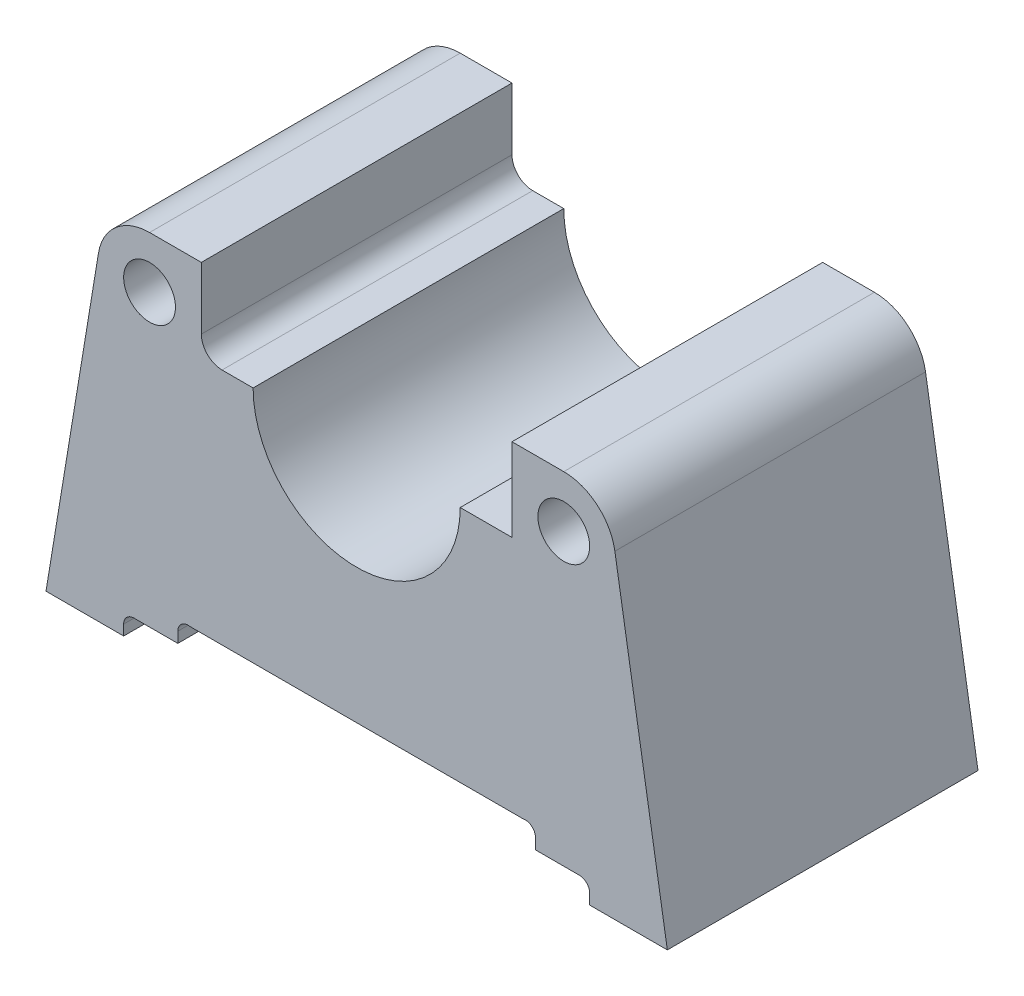
ISO-10303-21;
HEADER;
FILE_DESCRIPTION(('STEP AP214'),'2;1');
FILE_NAME('part.step','',(''),(''),'','','');
FILE_SCHEMA(('AUTOMOTIVE_DESIGN { 1 0 10303 214 1 1 1 1 }'));
ENDSEC;
DATA;
#1=APPLICATION_CONTEXT('core data for automotive mechanical design processes');
#2=APPLICATION_PROTOCOL_DEFINITION('international standard','automotive_design',2000,#1);
#3=PRODUCT_CONTEXT('',#1,'mechanical');
#4=PRODUCT('Part','Part','',(#3));
#5=PRODUCT_RELATED_PRODUCT_CATEGORY('part','',(#4));
#6=PRODUCT_DEFINITION_FORMATION('','',#4);
#7=PRODUCT_DEFINITION_CONTEXT('part definition',#1,'design');
#8=PRODUCT_DEFINITION('design','',#6,#7);
#9=PRODUCT_DEFINITION_SHAPE('','',#8);
#10=(LENGTH_UNIT() NAMED_UNIT(*) SI_UNIT(.MILLI.,.METRE.));
#11=(NAMED_UNIT(*) PLANE_ANGLE_UNIT() SI_UNIT($,.RADIAN.));
#12=(NAMED_UNIT(*) SI_UNIT($,.STERADIAN.) SOLID_ANGLE_UNIT());
#13=UNCERTAINTY_MEASURE_WITH_UNIT(LENGTH_MEASURE(1.E-05),#10,'distance_accuracy_value','');
#14=(GEOMETRIC_REPRESENTATION_CONTEXT(3) GLOBAL_UNCERTAINTY_ASSIGNED_CONTEXT((#13)) GLOBAL_UNIT_ASSIGNED_CONTEXT((#10,
#11,#12)) REPRESENTATION_CONTEXT('',''));
#15=CARTESIAN_POINT('',(0.,0.,0.));
#16=DIRECTION('',(0.,0.,1.));
#17=DIRECTION('',(1.,0.,0.));
#18=AXIS2_PLACEMENT_3D('',#15,#16,#17);
#19=CARTESIAN_POINT('',(-13.,29.,15.));
#20=DIRECTION('',(0.,0.,-1.));
#21=DIRECTION('',(-1.,0.,0.));
#22=AXIS2_PLACEMENT_3D('',#19,#20,#21);
#23=CYLINDRICAL_SURFACE('',#22,2.);
#24=CARTESIAN_POINT('',(-13.,29.,-15.));
#25=DIRECTION('',(0.,0.,1.));
#26=DIRECTION('',(1.,0.,0.));
#27=AXIS2_PLACEMENT_3D('',#24,#25,#26);
#28=CIRCLE('',#27,2.);
#29=CARTESIAN_POINT('',(-15.,29.,-15.));
#30=VERTEX_POINT('',#29);
#31=CARTESIAN_POINT('',(-13.,27.,-15.));
#32=VERTEX_POINT('',#31);
#33=EDGE_CURVE('E235',#30,#32,#28,.T.);
#34=ORIENTED_EDGE('',*,*,#33,.F.);
#35=DIRECTION('',(0.,0.,-1.));
#36=VECTOR('',#35,1.);
#37=CARTESIAN_POINT('',(-15.,29.,15.));
#38=LINE('',#37,#36);
#39=CARTESIAN_POINT('',(-15.,29.,15.));
#40=VERTEX_POINT('',#39);
#41=EDGE_CURVE('E11',#40,#30,#38,.T.);
#42=ORIENTED_EDGE('',*,*,#41,.F.);
#43=CARTESIAN_POINT('',(-13.,29.,15.));
#44=DIRECTION('',(0.,0.,1.));
#45=DIRECTION('',(1.,0.,0.));
#46=AXIS2_PLACEMENT_3D('',#43,#44,#45);
#47=CIRCLE('',#46,2.);
#48=CARTESIAN_POINT('',(-13.,27.,15.));
#49=VERTEX_POINT('',#48);
#50=EDGE_CURVE('E300',#40,#49,#47,.T.);
#51=ORIENTED_EDGE('',*,*,#50,.T.);
#52=DIRECTION('',(0.,0.,-1.));
#53=VECTOR('',#52,1.);
#54=CARTESIAN_POINT('',(-13.,27.,15.));
#55=LINE('',#54,#53);
#56=EDGE_CURVE('E49',#49,#32,#55,.T.);
#57=ORIENTED_EDGE('',*,*,#56,.T.);
#58=EDGE_LOOP('',(#34,#42,#51,#57));
#59=FACE_BOUND('',#58,.T.);
#60=ADVANCED_FACE('F33',(#59),#23,.F.);
#61=CARTESIAN_POINT('',(-15.,0.,15.));
#62=DIRECTION('',(1.,0.,0.));
#63=DIRECTION('',(0.,1.,0.));
#64=AXIS2_PLACEMENT_3D('',#61,#62,#63);
#65=PLANE('',#64);
#66=DIRECTION('',(0.,-1.,0.));
#67=VECTOR('',#66,1.);
#68=CARTESIAN_POINT('',(-15.,0.,-15.));
#69=LINE('',#68,#67);
#70=CARTESIAN_POINT('',(-15.,35.,-15.));
#71=VERTEX_POINT('',#70);
#72=EDGE_CURVE('E237',#71,#30,#69,.T.);
#73=ORIENTED_EDGE('',*,*,#72,.F.);
#74=DIRECTION('',(0.,0.,-1.));
#75=VECTOR('',#74,1.);
#76=CARTESIAN_POINT('',(-15.,35.,15.));
#77=LINE('',#76,#75);
#78=CARTESIAN_POINT('',(-15.,35.,15.));
#79=VERTEX_POINT('',#78);
#80=EDGE_CURVE('E41',#79,#71,#77,.T.);
#81=ORIENTED_EDGE('',*,*,#80,.F.);
#82=DIRECTION('',(0.,-1.,0.));
#83=VECTOR('',#82,1.);
#84=CARTESIAN_POINT('',(-15.,0.,15.));
#85=LINE('',#84,#83);
#86=EDGE_CURVE('E367',#79,#40,#85,.T.);
#87=ORIENTED_EDGE('',*,*,#86,.T.);
#88=ORIENTED_EDGE('',*,*,#41,.T.);
#89=EDGE_LOOP('',(#73,#81,#87,#88));
#90=FACE_BOUND('',#89,.T.);
#91=ADVANCED_FACE('F366',(#90),#65,.T.);
#92=CARTESIAN_POINT('',(0.,35.,15.));
#93=DIRECTION('',(0.,-1.,0.));
#94=DIRECTION('',(0.,0.,-1.));
#95=AXIS2_PLACEMENT_3D('',#92,#93,#94);
#96=PLANE('',#95);
#97=DIRECTION('',(-1.,0.,0.));
#98=VECTOR('',#97,1.);
#99=CARTESIAN_POINT('',(0.,35.,-15.));
#100=LINE('',#99,#98);
#101=CARTESIAN_POINT('',(-20.,35.,-15.));
#102=VERTEX_POINT('',#101);
#103=EDGE_CURVE('E240',#71,#102,#100,.T.);
#104=ORIENTED_EDGE('',*,*,#103,.T.);
#105=DIRECTION('',(0.,0.,-1.));
#106=VECTOR('',#105,1.);
#107=CARTESIAN_POINT('',(-20.,35.,15.));
#108=LINE('',#107,#106);
#109=CARTESIAN_POINT('',(-20.,35.,15.));
#110=VERTEX_POINT('',#109);
#111=EDGE_CURVE('E351',#110,#102,#108,.T.);
#112=ORIENTED_EDGE('',*,*,#111,.F.);
#113=DIRECTION('',(-1.,0.,0.));
#114=VECTOR('',#113,1.);
#115=CARTESIAN_POINT('',(0.,35.,15.));
#116=LINE('',#115,#114);
#117=EDGE_CURVE('E357',#79,#110,#116,.T.);
#118=ORIENTED_EDGE('',*,*,#117,.F.);
#119=ORIENTED_EDGE('',*,*,#80,.T.);
#120=EDGE_LOOP('',(#104,#112,#118,#119));
#121=FACE_BOUND('',#120,.T.);
#122=ADVANCED_FACE('F355',(#121),#96,.F.);
#123=CARTESIAN_POINT('',(-20.,30.,15.));
#124=DIRECTION('',(0.,0.,-1.));
#125=DIRECTION('',(-1.,0.,0.));
#126=AXIS2_PLACEMENT_3D('',#123,#124,#125);
#127=CYLINDRICAL_SURFACE('',#126,5.00000000000001);
#128=CARTESIAN_POINT('',(-20.,30.,-15.));
#129=DIRECTION('',(0.,0.,1.));
#130=DIRECTION('',(1.,0.,0.));
#131=AXIS2_PLACEMENT_3D('',#128,#129,#130);
#132=CIRCLE('',#131,5.00000000000001);
#133=CARTESIAN_POINT('',(-24.9337484987988,30.8112494995996,-15.));
#134=VERTEX_POINT('',#133);
#135=EDGE_CURVE('E243',#134,#102,#132,.F.);
#136=ORIENTED_EDGE('',*,*,#135,.F.);
#137=DIRECTION('',(0.,0.,-1.));
#138=VECTOR('',#137,1.);
#139=CARTESIAN_POINT('',(-24.9337484987988,30.8112494995996,15.));
#140=LINE('',#139,#138);
#141=CARTESIAN_POINT('',(-24.9337484987988,30.8112494995996,15.));
#142=VERTEX_POINT('',#141);
#143=EDGE_CURVE('E349',#142,#134,#140,.T.);
#144=ORIENTED_EDGE('',*,*,#143,.F.);
#145=CARTESIAN_POINT('',(-20.,30.,15.));
#146=DIRECTION('',(0.,0.,1.));
#147=DIRECTION('',(1.,0.,0.));
#148=AXIS2_PLACEMENT_3D('',#145,#146,#147);
#149=CIRCLE('',#148,5.00000000000001);
#150=EDGE_CURVE('E733',#142,#110,#149,.F.);
#151=ORIENTED_EDGE('',*,*,#150,.T.);
#152=ORIENTED_EDGE('',*,*,#111,.T.);
#153=EDGE_LOOP('',(#136,#144,#151,#152));
#154=FACE_BOUND('',#153,.T.);
#155=ADVANCED_FACE('F389',(#154),#127,.T.);
#156=CARTESIAN_POINT('',(-29.2102490992793,4.80300120096094,15.));
#157=DIRECTION('',(-0.98674969975976,0.162249899919919,0.));
#158=DIRECTION('',(-0.162249899919919,-0.98674969975976,0.));
#159=AXIS2_PLACEMENT_3D('',#156,#157,#158);
#160=PLANE('',#159);
#161=DIRECTION('',(0.162249899919919,0.98674969975976,0.));
#162=VECTOR('',#161,1.);
#163=CARTESIAN_POINT('',(-29.2102490992793,4.80300120096094,-15.));
#164=LINE('',#163,#162);
#165=CARTESIAN_POINT('',(-30.,0.,-15.));
#166=VERTEX_POINT('',#165);
#167=EDGE_CURVE('E246',#166,#134,#164,.T.);
#168=ORIENTED_EDGE('',*,*,#167,.F.);
#169=DIRECTION('',(0.,0.,-1.));
#170=VECTOR('',#169,1.);
#171=CARTESIAN_POINT('',(-30.,0.,15.));
#172=LINE('',#171,#170);
#173=CARTESIAN_POINT('',(-30.,0.,15.));
#174=VERTEX_POINT('',#173);
#175=EDGE_CURVE('E347',#174,#166,#172,.T.);
#176=ORIENTED_EDGE('',*,*,#175,.F.);
#177=DIRECTION('',(0.162249899919919,0.98674969975976,0.));
#178=VECTOR('',#177,1.);
#179=CARTESIAN_POINT('',(-29.2102490992793,4.80300120096094,15.));
#180=LINE('',#179,#178);
#181=EDGE_CURVE('E730',#174,#142,#180,.T.);
#182=ORIENTED_EDGE('',*,*,#181,.T.);
#183=ORIENTED_EDGE('',*,*,#143,.T.);
#184=EDGE_LOOP('',(#168,#176,#182,#183));
#185=FACE_BOUND('',#184,.T.);
#186=ADVANCED_FACE('F394',(#185),#160,.T.);
#187=CARTESIAN_POINT('',(0.,0.,15.));
#188=DIRECTION('',(0.,-1.,0.));
#189=DIRECTION('',(1.,0.,0.));
#190=AXIS2_PLACEMENT_3D('',#187,#188,#189);
#191=PLANE('',#190);
#192=DIRECTION('',(-1.,0.,0.));
#193=VECTOR('',#192,1.);
#194=CARTESIAN_POINT('',(0.,0.,-15.));
#195=LINE('',#194,#193);
#196=CARTESIAN_POINT('',(-22.5,0.,-15.));
#197=VERTEX_POINT('',#196);
#198=EDGE_CURVE('E249',#197,#166,#195,.T.);
#199=ORIENTED_EDGE('',*,*,#198,.F.);
#200=DIRECTION('',(0.,0.,-1.));
#201=VECTOR('',#200,1.);
#202=CARTESIAN_POINT('',(-22.5,0.,15.));
#203=LINE('',#202,#201);
#204=CARTESIAN_POINT('',(-22.5,0.,15.));
#205=VERTEX_POINT('',#204);
#206=EDGE_CURVE('E345',#205,#197,#203,.T.);
#207=ORIENTED_EDGE('',*,*,#206,.F.);
#208=DIRECTION('',(-1.,0.,0.));
#209=VECTOR('',#208,1.);
#210=CARTESIAN_POINT('',(0.,0.,15.));
#211=LINE('',#210,#209);
#212=EDGE_CURVE('E727',#205,#174,#211,.T.);
#213=ORIENTED_EDGE('',*,*,#212,.T.);
#214=ORIENTED_EDGE('',*,*,#175,.T.);
#215=EDGE_LOOP('',(#199,#207,#213,#214));
#216=FACE_BOUND('',#215,.T.);
#217=ADVANCED_FACE('F398',(#216),#191,.T.);
#218=CARTESIAN_POINT('',(-22.5,0.,15.));
#219=DIRECTION('',(1.,0.,0.));
#220=DIRECTION('',(0.,0.,-1.));
#221=AXIS2_PLACEMENT_3D('',#218,#219,#220);
#222=PLANE('',#221);
#223=DIRECTION('',(0.,-1.,0.));
#224=VECTOR('',#223,1.);
#225=CARTESIAN_POINT('',(-22.5,0.,-15.));
#226=LINE('',#225,#224);
#227=CARTESIAN_POINT('',(-22.5,0.999999999999999,-15.));
#228=VERTEX_POINT('',#227);
#229=EDGE_CURVE('E252',#228,#197,#226,.T.);
#230=ORIENTED_EDGE('',*,*,#229,.F.);
#231=DIRECTION('',(0.,0.,-1.));
#232=VECTOR('',#231,1.);
#233=CARTESIAN_POINT('',(-22.5,0.999999999999999,15.));
#234=LINE('',#233,#232);
#235=CARTESIAN_POINT('',(-22.5,0.999999999999999,15.));
#236=VERTEX_POINT('',#235);
#237=EDGE_CURVE('E343',#236,#228,#234,.T.);
#238=ORIENTED_EDGE('',*,*,#237,.F.);
#239=DIRECTION('',(0.,-1.,0.));
#240=VECTOR('',#239,1.);
#241=CARTESIAN_POINT('',(-22.5,0.,15.));
#242=LINE('',#241,#240);
#243=EDGE_CURVE('E722',#236,#205,#242,.T.);
#244=ORIENTED_EDGE('',*,*,#243,.T.);
#245=ORIENTED_EDGE('',*,*,#206,.T.);
#246=EDGE_LOOP('',(#230,#238,#244,#245));
#247=FACE_BOUND('',#246,.T.);
#248=ADVANCED_FACE('F402',(#247),#222,.T.);
#249=CARTESIAN_POINT('',(-21.5,1.00000000000001,15.));
#250=DIRECTION('',(0.,0.,-1.));
#251=DIRECTION('',(-1.,0.,0.));
#252=AXIS2_PLACEMENT_3D('',#249,#250,#251);
#253=CYLINDRICAL_SURFACE('',#252,1.);
#254=CARTESIAN_POINT('',(-21.5,1.00000000000001,-15.));
#255=DIRECTION('',(0.,0.,1.));
#256=DIRECTION('',(1.,0.,0.));
#257=AXIS2_PLACEMENT_3D('',#254,#255,#256);
#258=CIRCLE('',#257,1.);
#259=CARTESIAN_POINT('',(-21.5,2.00000000000001,-15.));
#260=VERTEX_POINT('',#259);
#261=EDGE_CURVE('E255',#228,#260,#258,.F.);
#262=ORIENTED_EDGE('',*,*,#261,.T.);
#263=DIRECTION('',(0.,0.,-1.));
#264=VECTOR('',#263,1.);
#265=CARTESIAN_POINT('',(-21.5,2.00000000000001,15.));
#266=LINE('',#265,#264);
#267=CARTESIAN_POINT('',(-21.5,2.00000000000001,15.));
#268=VERTEX_POINT('',#267);
#269=EDGE_CURVE('E341',#268,#260,#266,.T.);
#270=ORIENTED_EDGE('',*,*,#269,.F.);
#271=CARTESIAN_POINT('',(-21.5,1.00000000000001,15.));
#272=DIRECTION('',(0.,0.,1.));
#273=DIRECTION('',(1.,0.,0.));
#274=AXIS2_PLACEMENT_3D('',#271,#272,#273);
#275=CIRCLE('',#274,1.);
#276=EDGE_CURVE('E719',#236,#268,#275,.F.);
#277=ORIENTED_EDGE('',*,*,#276,.F.);
#278=ORIENTED_EDGE('',*,*,#237,.T.);
#279=EDGE_LOOP('',(#262,#270,#277,#278));
#280=FACE_BOUND('',#279,.T.);
#281=ADVANCED_FACE('F406',(#280),#253,.F.);
#282=CARTESIAN_POINT('',(0.,1.99999999999997,15.));
#283=DIRECTION('',(0.,-1.,0.));
#284=DIRECTION('',(1.,0.,0.));
#285=AXIS2_PLACEMENT_3D('',#282,#283,#284);
#286=PLANE('',#285);
#287=DIRECTION('',(-1.,0.,0.));
#288=VECTOR('',#287,1.);
#289=CARTESIAN_POINT('',(0.,1.99999999999997,-15.));
#290=LINE('',#289,#288);
#291=CARTESIAN_POINT('',(-17.2717331876623,2.,-15.));
#292=VERTEX_POINT('',#291);
#293=EDGE_CURVE('E258',#292,#260,#290,.T.);
#294=ORIENTED_EDGE('',*,*,#293,.F.);
#295=DIRECTION('',(0.,0.,-1.));
#296=VECTOR('',#295,1.);
#297=CARTESIAN_POINT('',(-17.2717331876623,2.,15.));
#298=LINE('',#297,#296);
#299=CARTESIAN_POINT('',(-17.2717331876623,2.,15.));
#300=VERTEX_POINT('',#299);
#301=EDGE_CURVE('E339',#300,#292,#298,.T.);
#302=ORIENTED_EDGE('',*,*,#301,.F.);
#303=DIRECTION('',(-1.,0.,0.));
#304=VECTOR('',#303,1.);
#305=CARTESIAN_POINT('',(0.,1.99999999999997,15.));
#306=LINE('',#305,#304);
#307=EDGE_CURVE('E717',#300,#268,#306,.T.);
#308=ORIENTED_EDGE('',*,*,#307,.T.);
#309=ORIENTED_EDGE('',*,*,#269,.T.);
#310=EDGE_LOOP('',(#294,#302,#308,#309));
#311=FACE_BOUND('',#310,.T.);
#312=ADVANCED_FACE('F410',(#311),#286,.T.);
#313=CARTESIAN_POINT('',(-17.2717331876623,0.,15.));
#314=DIRECTION('',(1.,0.,0.));
#315=DIRECTION('',(0.,0.,-1.));
#316=AXIS2_PLACEMENT_3D('',#313,#314,#315);
#317=PLANE('',#316);
#318=DIRECTION('',(0.,-1.,0.));
#319=VECTOR('',#318,1.);
#320=CARTESIAN_POINT('',(-17.2717331876623,0.,-15.));
#321=LINE('',#320,#319);
#322=CARTESIAN_POINT('',(-17.2717331876623,3.02246801223134,-15.));
#323=VERTEX_POINT('',#322);
#324=EDGE_CURVE('E261',#323,#292,#321,.T.);
#325=ORIENTED_EDGE('',*,*,#324,.F.);
#326=DIRECTION('',(0.,0.,-1.));
#327=VECTOR('',#326,1.);
#328=CARTESIAN_POINT('',(-17.2717331876623,3.02246801223134,15.));
#329=LINE('',#328,#327);
#330=CARTESIAN_POINT('',(-17.2717331876623,3.02246801223134,15.));
#331=VERTEX_POINT('',#330);
#332=EDGE_CURVE('E337',#331,#323,#329,.T.);
#333=ORIENTED_EDGE('',*,*,#332,.F.);
#334=DIRECTION('',(0.,-1.,0.));
#335=VECTOR('',#334,1.);
#336=CARTESIAN_POINT('',(-17.2717331876623,0.,15.));
#337=LINE('',#336,#335);
#338=EDGE_CURVE('E710',#331,#300,#337,.T.);
#339=ORIENTED_EDGE('',*,*,#338,.T.);
#340=ORIENTED_EDGE('',*,*,#301,.T.);
#341=EDGE_LOOP('',(#325,#333,#339,#340));
#342=FACE_BOUND('',#341,.T.);
#343=ADVANCED_FACE('F414',(#342),#317,.T.);
#344=CARTESIAN_POINT('',(-16.2717331876623,3.02246801223134,15.));
#345=DIRECTION('',(0.,0.,-1.));
#346=DIRECTION('',(-1.,0.,0.));
#347=AXIS2_PLACEMENT_3D('',#344,#345,#346);
#348=CYLINDRICAL_SURFACE('',#347,1.);
#349=CARTESIAN_POINT('',(-16.2717331876623,3.02246801223134,-15.));
#350=DIRECTION('',(0.,0.,1.));
#351=DIRECTION('',(1.,0.,0.));
#352=AXIS2_PLACEMENT_3D('',#349,#350,#351);
#353=CIRCLE('',#352,1.);
#354=CARTESIAN_POINT('',(-16.0609460607095,4.,-15.));
#355=VERTEX_POINT('',#354);
#356=EDGE_CURVE('E264',#323,#355,#353,.F.);
#357=ORIENTED_EDGE('',*,*,#356,.T.);
#358=DIRECTION('',(0.,0.,-1.));
#359=VECTOR('',#358,1.);
#360=CARTESIAN_POINT('',(-16.0609460607095,4.,15.));
#361=LINE('',#360,#359);
#362=CARTESIAN_POINT('',(-16.0609460607095,4.,15.));
#363=VERTEX_POINT('',#362);
#364=EDGE_CURVE('E334',#363,#355,#361,.T.);
#365=ORIENTED_EDGE('',*,*,#364,.F.);
#366=CARTESIAN_POINT('',(-16.2717331876623,3.02246801223134,15.));
#367=DIRECTION('',(0.,0.,1.));
#368=DIRECTION('',(1.,0.,0.));
#369=AXIS2_PLACEMENT_3D('',#366,#367,#368);
#370=CIRCLE('',#369,1.);
#371=EDGE_CURVE('E707',#331,#363,#370,.F.);
#372=ORIENTED_EDGE('',*,*,#371,.F.);
#373=ORIENTED_EDGE('',*,*,#332,.T.);
#374=EDGE_LOOP('',(#357,#365,#372,#373));
#375=FACE_BOUND('',#374,.T.);
#376=ADVANCED_FACE('F418',(#375),#348,.F.);
#377=CARTESIAN_POINT('',(0.,4.,15.));
#378=DIRECTION('',(0.,1.,0.));
#379=DIRECTION('',(0.,0.,1.));
#380=AXIS2_PLACEMENT_3D('',#377,#378,#379);
#381=PLANE('',#380);
#382=DIRECTION('',(1.,0.,0.));
#383=VECTOR('',#382,1.);
#384=CARTESIAN_POINT('',(0.,4.,-15.));
#385=LINE('',#384,#383);
#386=CARTESIAN_POINT('',(16.0609460607095,4.,-15.));
#387=VERTEX_POINT('',#386);
#388=EDGE_CURVE('E266',#355,#387,#385,.T.);
#389=ORIENTED_EDGE('',*,*,#388,.T.);
#390=DIRECTION('',(0.,0.,-1.));
#391=VECTOR('',#390,1.);
#392=CARTESIAN_POINT('',(16.0609460607095,4.,15.));
#393=LINE('',#392,#391);
#394=CARTESIAN_POINT('',(16.0609460607095,4.,15.));
#395=VERTEX_POINT('',#394);
#396=EDGE_CURVE('E331',#395,#387,#393,.T.);
#397=ORIENTED_EDGE('',*,*,#396,.F.);
#398=DIRECTION('',(1.,0.,0.));
#399=VECTOR('',#398,1.);
#400=CARTESIAN_POINT('',(0.,4.,15.));
#401=LINE('',#400,#399);
#402=EDGE_CURVE('E705',#363,#395,#401,.T.);
#403=ORIENTED_EDGE('',*,*,#402,.F.);
#404=ORIENTED_EDGE('',*,*,#364,.T.);
#405=EDGE_LOOP('',(#389,#397,#403,#404));
#406=FACE_BOUND('',#405,.T.);
#407=ADVANCED_FACE('F422',(#406),#381,.F.);
#408=CARTESIAN_POINT('',(16.2717331876623,3.02246801223134,15.));
#409=DIRECTION('',(0.,0.,-1.));
#410=DIRECTION('',(-1.,0.,0.));
#411=AXIS2_PLACEMENT_3D('',#408,#409,#410);
#412=CYLINDRICAL_SURFACE('',#411,1.);
#413=CARTESIAN_POINT('',(16.2717331876623,3.02246801223134,-15.));
#414=DIRECTION('',(0.,0.,1.));
#415=DIRECTION('',(1.,0.,0.));
#416=AXIS2_PLACEMENT_3D('',#413,#414,#415);
#417=CIRCLE('',#416,1.);
#418=CARTESIAN_POINT('',(17.2717331876623,3.02246801223134,-15.));
#419=VERTEX_POINT('',#418);
#420=EDGE_CURVE('E268',#387,#419,#417,.F.);
#421=ORIENTED_EDGE('',*,*,#420,.T.);
#422=DIRECTION('',(0.,0.,-1.));
#423=VECTOR('',#422,1.);
#424=CARTESIAN_POINT('',(17.2717331876623,3.02246801223134,15.));
#425=LINE('',#424,#423);
#426=CARTESIAN_POINT('',(17.2717331876623,3.02246801223134,15.));
#427=VERTEX_POINT('',#426);
#428=EDGE_CURVE('E328',#427,#419,#425,.T.);
#429=ORIENTED_EDGE('',*,*,#428,.F.);
#430=CARTESIAN_POINT('',(16.2717331876623,3.02246801223134,15.));
#431=DIRECTION('',(0.,0.,1.));
#432=DIRECTION('',(1.,0.,0.));
#433=AXIS2_PLACEMENT_3D('',#430,#431,#432);
#434=CIRCLE('',#433,1.);
#435=EDGE_CURVE('E698',#395,#427,#434,.F.);
#436=ORIENTED_EDGE('',*,*,#435,.F.);
#437=ORIENTED_EDGE('',*,*,#396,.T.);
#438=EDGE_LOOP('',(#421,#429,#436,#437));
#439=FACE_BOUND('',#438,.T.);
#440=ADVANCED_FACE('F426',(#439),#412,.F.);
#441=CARTESIAN_POINT('',(17.2717331876623,0.,15.));
#442=DIRECTION('',(1.,0.,0.));
#443=DIRECTION('',(0.,0.,-1.));
#444=AXIS2_PLACEMENT_3D('',#441,#442,#443);
#445=PLANE('',#444);
#446=DIRECTION('',(0.,-1.,0.));
#447=VECTOR('',#446,1.);
#448=CARTESIAN_POINT('',(17.2717331876623,0.,-15.));
#449=LINE('',#448,#447);
#450=CARTESIAN_POINT('',(17.2717331876623,2.,-15.));
#451=VERTEX_POINT('',#450);
#452=EDGE_CURVE('E270',#419,#451,#449,.T.);
#453=ORIENTED_EDGE('',*,*,#452,.T.);
#454=DIRECTION('',(0.,0.,-1.));
#455=VECTOR('',#454,1.);
#456=CARTESIAN_POINT('',(17.2717331876623,2.,15.));
#457=LINE('',#456,#455);
#458=CARTESIAN_POINT('',(17.2717331876623,2.,15.));
#459=VERTEX_POINT('',#458);
#460=EDGE_CURVE('E325',#459,#451,#457,.T.);
#461=ORIENTED_EDGE('',*,*,#460,.F.);
#462=DIRECTION('',(0.,-1.,0.));
#463=VECTOR('',#462,1.);
#464=CARTESIAN_POINT('',(17.2717331876623,0.,15.));
#465=LINE('',#464,#463);
#466=EDGE_CURVE('E695',#427,#459,#465,.T.);
#467=ORIENTED_EDGE('',*,*,#466,.F.);
#468=ORIENTED_EDGE('',*,*,#428,.T.);
#469=EDGE_LOOP('',(#453,#461,#467,#468));
#470=FACE_BOUND('',#469,.T.);
#471=ADVANCED_FACE('F430',(#470),#445,.F.);
#472=CARTESIAN_POINT('',(0.,2.,15.));
#473=DIRECTION('',(0.,1.,0.));
#474=DIRECTION('',(0.,0.,1.));
#475=AXIS2_PLACEMENT_3D('',#472,#473,#474);
#476=PLANE('',#475);
#477=DIRECTION('',(1.,0.,0.));
#478=VECTOR('',#477,1.);
#479=CARTESIAN_POINT('',(0.,2.,-15.));
#480=LINE('',#479,#478);
#481=CARTESIAN_POINT('',(21.5,2.,-15.));
#482=VERTEX_POINT('',#481);
#483=EDGE_CURVE('E272',#451,#482,#480,.T.);
#484=ORIENTED_EDGE('',*,*,#483,.T.);
#485=DIRECTION('',(0.,0.,-1.));
#486=VECTOR('',#485,1.);
#487=CARTESIAN_POINT('',(21.5,2.,15.));
#488=LINE('',#487,#486);
#489=CARTESIAN_POINT('',(21.5,2.,15.));
#490=VERTEX_POINT('',#489);
#491=EDGE_CURVE('E322',#490,#482,#488,.T.);
#492=ORIENTED_EDGE('',*,*,#491,.F.);
#493=DIRECTION('',(1.,0.,0.));
#494=VECTOR('',#493,1.);
#495=CARTESIAN_POINT('',(0.,2.,15.));
#496=LINE('',#495,#494);
#497=EDGE_CURVE('E693',#459,#490,#496,.T.);
#498=ORIENTED_EDGE('',*,*,#497,.F.);
#499=ORIENTED_EDGE('',*,*,#460,.T.);
#500=EDGE_LOOP('',(#484,#492,#498,#499));
#501=FACE_BOUND('',#500,.T.);
#502=ADVANCED_FACE('F434',(#501),#476,.F.);
#503=CARTESIAN_POINT('',(21.5,1.,15.));
#504=DIRECTION('',(0.,0.,-1.));
#505=DIRECTION('',(-1.,0.,0.));
#506=AXIS2_PLACEMENT_3D('',#503,#504,#505);
#507=CYLINDRICAL_SURFACE('',#506,1.);
#508=CARTESIAN_POINT('',(21.5,1.,-15.));
#509=DIRECTION('',(0.,0.,1.));
#510=DIRECTION('',(1.,0.,0.));
#511=AXIS2_PLACEMENT_3D('',#508,#509,#510);
#512=CIRCLE('',#511,1.);
#513=CARTESIAN_POINT('',(22.5,0.999999999999995,-15.));
#514=VERTEX_POINT('',#513);
#515=EDGE_CURVE('E274',#482,#514,#512,.F.);
#516=ORIENTED_EDGE('',*,*,#515,.T.);
#517=DIRECTION('',(0.,0.,-1.));
#518=VECTOR('',#517,1.);
#519=CARTESIAN_POINT('',(22.5,0.999999999999995,15.));
#520=LINE('',#519,#518);
#521=CARTESIAN_POINT('',(22.5,0.999999999999995,15.));
#522=VERTEX_POINT('',#521);
#523=EDGE_CURVE('E319',#522,#514,#520,.T.);
#524=ORIENTED_EDGE('',*,*,#523,.F.);
#525=CARTESIAN_POINT('',(21.5,1.,15.));
#526=DIRECTION('',(0.,0.,1.));
#527=DIRECTION('',(1.,0.,0.));
#528=AXIS2_PLACEMENT_3D('',#525,#526,#527);
#529=CIRCLE('',#528,1.);
#530=EDGE_CURVE('E686',#490,#522,#529,.F.);
#531=ORIENTED_EDGE('',*,*,#530,.F.);
#532=ORIENTED_EDGE('',*,*,#491,.T.);
#533=EDGE_LOOP('',(#516,#524,#531,#532));
#534=FACE_BOUND('',#533,.T.);
#535=ADVANCED_FACE('F438',(#534),#507,.F.);
#536=CARTESIAN_POINT('',(22.5,0.,15.));
#537=DIRECTION('',(1.,0.,0.));
#538=DIRECTION('',(0.,0.,-1.));
#539=AXIS2_PLACEMENT_3D('',#536,#537,#538);
#540=PLANE('',#539);
#541=DIRECTION('',(0.,-1.,0.));
#542=VECTOR('',#541,1.);
#543=CARTESIAN_POINT('',(22.5,0.,-15.));
#544=LINE('',#543,#542);
#545=CARTESIAN_POINT('',(22.5,0.,-15.));
#546=VERTEX_POINT('',#545);
#547=EDGE_CURVE('E276',#514,#546,#544,.T.);
#548=ORIENTED_EDGE('',*,*,#547,.T.);
#549=DIRECTION('',(0.,0.,-1.));
#550=VECTOR('',#549,1.);
#551=CARTESIAN_POINT('',(22.5,0.,15.));
#552=LINE('',#551,#550);
#553=CARTESIAN_POINT('',(22.5,0.,15.));
#554=VERTEX_POINT('',#553);
#555=EDGE_CURVE('E316',#554,#546,#552,.T.);
#556=ORIENTED_EDGE('',*,*,#555,.F.);
#557=DIRECTION('',(0.,-1.,0.));
#558=VECTOR('',#557,1.);
#559=CARTESIAN_POINT('',(22.5,0.,15.));
#560=LINE('',#559,#558);
#561=EDGE_CURVE('E683',#522,#554,#560,.T.);
#562=ORIENTED_EDGE('',*,*,#561,.F.);
#563=ORIENTED_EDGE('',*,*,#523,.T.);
#564=EDGE_LOOP('',(#548,#556,#562,#563));
#565=FACE_BOUND('',#564,.T.);
#566=ADVANCED_FACE('F442',(#565),#540,.F.);
#567=CARTESIAN_POINT('',(0.,0.,15.));
#568=DIRECTION('',(0.,1.,0.));
#569=DIRECTION('',(-1.,0.,0.));
#570=AXIS2_PLACEMENT_3D('',#567,#568,#569);
#571=PLANE('',#570);
#572=DIRECTION('',(1.,0.,0.));
#573=VECTOR('',#572,1.);
#574=CARTESIAN_POINT('',(0.,0.,-15.));
#575=LINE('',#574,#573);
#576=CARTESIAN_POINT('',(30.,0.,-15.));
#577=VERTEX_POINT('',#576);
#578=EDGE_CURVE('E278',#546,#577,#575,.T.);
#579=ORIENTED_EDGE('',*,*,#578,.T.);
#580=DIRECTION('',(0.,0.,-1.));
#581=VECTOR('',#580,1.);
#582=CARTESIAN_POINT('',(30.,0.,15.));
#583=LINE('',#582,#581);
#584=CARTESIAN_POINT('',(30.,0.,15.));
#585=VERTEX_POINT('',#584);
#586=EDGE_CURVE('E313',#585,#577,#583,.T.);
#587=ORIENTED_EDGE('',*,*,#586,.F.);
#588=DIRECTION('',(1.,0.,0.));
#589=VECTOR('',#588,1.);
#590=CARTESIAN_POINT('',(0.,0.,15.));
#591=LINE('',#590,#589);
#592=EDGE_CURVE('E681',#554,#585,#591,.T.);
#593=ORIENTED_EDGE('',*,*,#592,.F.);
#594=ORIENTED_EDGE('',*,*,#555,.T.);
#595=EDGE_LOOP('',(#579,#587,#593,#594));
#596=FACE_BOUND('',#595,.T.);
#597=ADVANCED_FACE('F446',(#596),#571,.F.);
#598=CARTESIAN_POINT('',(29.2102490992793,4.80300120096094,15.));
#599=DIRECTION('',(-0.98674969975976,-0.162249899919919,0.));
#600=DIRECTION('',(0.162249899919919,-0.98674969975976,0.));
#601=AXIS2_PLACEMENT_3D('',#598,#599,#600);
#602=PLANE('',#601);
#603=DIRECTION('',(-0.162249899919919,0.98674969975976,0.));
#604=VECTOR('',#603,1.);
#605=CARTESIAN_POINT('',(29.2102490992793,4.80300120096094,-15.));
#606=LINE('',#605,#604);
#607=CARTESIAN_POINT('',(24.9337484987988,30.8112494995996,-15.));
#608=VERTEX_POINT('',#607);
#609=EDGE_CURVE('E280',#577,#608,#606,.T.);
#610=ORIENTED_EDGE('',*,*,#609,.T.);
#611=DIRECTION('',(0.,0.,-1.));
#612=VECTOR('',#611,1.);
#613=CARTESIAN_POINT('',(24.9337484987988,30.8112494995996,15.));
#614=LINE('',#613,#612);
#615=CARTESIAN_POINT('',(24.9337484987988,30.8112494995996,15.));
#616=VERTEX_POINT('',#615);
#617=EDGE_CURVE('E310',#616,#608,#614,.T.);
#618=ORIENTED_EDGE('',*,*,#617,.F.);
#619=DIRECTION('',(-0.162249899919919,0.98674969975976,0.));
#620=VECTOR('',#619,1.);
#621=CARTESIAN_POINT('',(29.2102490992793,4.80300120096094,15.));
#622=LINE('',#621,#620);
#623=EDGE_CURVE('E674',#585,#616,#622,.T.);
#624=ORIENTED_EDGE('',*,*,#623,.F.);
#625=ORIENTED_EDGE('',*,*,#586,.T.);
#626=EDGE_LOOP('',(#610,#618,#624,#625));
#627=FACE_BOUND('',#626,.T.);
#628=ADVANCED_FACE('F450',(#627),#602,.F.);
#629=CARTESIAN_POINT('',(20.,30.,15.));
#630=DIRECTION('',(0.,0.,-1.));
#631=DIRECTION('',(-1.,0.,0.));
#632=AXIS2_PLACEMENT_3D('',#629,#630,#631);
#633=CYLINDRICAL_SURFACE('',#632,5.00000000000001);
#634=CARTESIAN_POINT('',(20.,30.,-15.));
#635=DIRECTION('',(0.,0.,1.));
#636=DIRECTION('',(1.,0.,0.));
#637=AXIS2_PLACEMENT_3D('',#634,#635,#636);
#638=CIRCLE('',#637,5.00000000000001);
#639=CARTESIAN_POINT('',(20.,35.,-15.));
#640=VERTEX_POINT('',#639);
#641=EDGE_CURVE('E282',#608,#640,#638,.T.);
#642=ORIENTED_EDGE('',*,*,#641,.T.);
#643=DIRECTION('',(0.,0.,-1.));
#644=VECTOR('',#643,1.);
#645=CARTESIAN_POINT('',(20.,35.,15.));
#646=LINE('',#645,#644);
#647=CARTESIAN_POINT('',(20.,35.,15.));
#648=VERTEX_POINT('',#647);
#649=EDGE_CURVE('E307',#648,#640,#646,.T.);
#650=ORIENTED_EDGE('',*,*,#649,.F.);
#651=CARTESIAN_POINT('',(20.,30.,15.));
#652=DIRECTION('',(0.,0.,1.));
#653=DIRECTION('',(1.,0.,0.));
#654=AXIS2_PLACEMENT_3D('',#651,#652,#653);
#655=CIRCLE('',#654,5.00000000000001);
#656=EDGE_CURVE('E671',#616,#648,#655,.T.);
#657=ORIENTED_EDGE('',*,*,#656,.F.);
#658=ORIENTED_EDGE('',*,*,#617,.T.);
#659=EDGE_LOOP('',(#642,#650,#657,#658));
#660=FACE_BOUND('',#659,.T.);
#661=ADVANCED_FACE('F454',(#660),#633,.T.);
#662=CARTESIAN_POINT('',(0.,35.,15.));
#663=DIRECTION('',(0.,-1.,0.));
#664=DIRECTION('',(0.,0.,-1.));
#665=AXIS2_PLACEMENT_3D('',#662,#663,#664);
#666=PLANE('',#665);
#667=DIRECTION('',(-1.,0.,0.));
#668=VECTOR('',#667,1.);
#669=CARTESIAN_POINT('',(0.,35.,-15.));
#670=LINE('',#669,#668);
#671=CARTESIAN_POINT('',(15.,35.,-15.));
#672=VERTEX_POINT('',#671);
#673=EDGE_CURVE('E284',#640,#672,#670,.T.);
#674=ORIENTED_EDGE('',*,*,#673,.T.);
#675=DIRECTION('',(0.,0.,-1.));
#676=VECTOR('',#675,1.);
#677=CARTESIAN_POINT('',(15.,35.,15.));
#678=LINE('',#677,#676);
#679=CARTESIAN_POINT('',(15.,35.,15.));
#680=VERTEX_POINT('',#679);
#681=EDGE_CURVE('E304',#680,#672,#678,.T.);
#682=ORIENTED_EDGE('',*,*,#681,.F.);
#683=DIRECTION('',(-1.,0.,0.));
#684=VECTOR('',#683,1.);
#685=CARTESIAN_POINT('',(0.,35.,15.));
#686=LINE('',#685,#684);
#687=EDGE_CURVE('E669',#648,#680,#686,.T.);
#688=ORIENTED_EDGE('',*,*,#687,.F.);
#689=ORIENTED_EDGE('',*,*,#649,.T.);
#690=EDGE_LOOP('',(#674,#682,#688,#689));
#691=FACE_BOUND('',#690,.T.);
#692=ADVANCED_FACE('F458',(#691),#666,.F.);
#693=CARTESIAN_POINT('',(15.,0.,15.));
#694=DIRECTION('',(1.,0.,0.));
#695=DIRECTION('',(0.,1.,0.));
#696=AXIS2_PLACEMENT_3D('',#693,#694,#695);
#697=PLANE('',#696);
#698=DIRECTION('',(0.,-1.,0.));
#699=VECTOR('',#698,1.);
#700=CARTESIAN_POINT('',(15.,0.,-15.));
#701=LINE('',#700,#699);
#702=CARTESIAN_POINT('',(15.,27.,-15.));
#703=VERTEX_POINT('',#702);
#704=EDGE_CURVE('E286',#672,#703,#701,.T.);
#705=ORIENTED_EDGE('',*,*,#704,.T.);
#706=DIRECTION('',(0.,0.,-1.));
#707=VECTOR('',#706,1.);
#708=CARTESIAN_POINT('',(15.,27.,15.));
#709=LINE('',#708,#707);
#710=CARTESIAN_POINT('',(15.,27.,15.));
#711=VERTEX_POINT('',#710);
#712=EDGE_CURVE('E221',#711,#703,#709,.T.);
#713=ORIENTED_EDGE('',*,*,#712,.F.);
#714=DIRECTION('',(0.,-1.,0.));
#715=VECTOR('',#714,1.);
#716=CARTESIAN_POINT('',(15.,0.,15.));
#717=LINE('',#716,#715);
#718=EDGE_CURVE('E209',#680,#711,#717,.T.);
#719=ORIENTED_EDGE('',*,*,#718,.F.);
#720=ORIENTED_EDGE('',*,*,#681,.T.);
#721=EDGE_LOOP('',(#705,#713,#719,#720));
#722=FACE_BOUND('',#721,.T.);
#723=ADVANCED_FACE('F462',(#722),#697,.F.);
#724=CARTESIAN_POINT('',(0.,27.,15.));
#725=DIRECTION('',(0.,-1.,0.));
#726=DIRECTION('',(1.,0.,0.));
#727=AXIS2_PLACEMENT_3D('',#724,#725,#726);
#728=PLANE('',#727);
#729=DIRECTION('',(-1.,0.,0.));
#730=VECTOR('',#729,1.);
#731=CARTESIAN_POINT('',(0.,27.,-15.));
#732=LINE('',#731,#730);
#733=CARTESIAN_POINT('',(10.,27.,-15.));
#734=VERTEX_POINT('',#733);
#735=EDGE_CURVE('E218',#703,#734,#732,.T.);
#736=ORIENTED_EDGE('',*,*,#735,.T.);
#737=DIRECTION('',(0.,0.,-1.));
#738=VECTOR('',#737,1.);
#739=CARTESIAN_POINT('',(10.,27.,15.));
#740=LINE('',#739,#738);
#741=CARTESIAN_POINT('',(10.,27.,15.));
#742=VERTEX_POINT('',#741);
#743=EDGE_CURVE('E215',#742,#734,#740,.T.);
#744=ORIENTED_EDGE('',*,*,#743,.F.);
#745=DIRECTION('',(-1.,0.,0.));
#746=VECTOR('',#745,1.);
#747=CARTESIAN_POINT('',(0.,27.,15.));
#748=LINE('',#747,#746);
#749=EDGE_CURVE('E201',#711,#742,#748,.T.);
#750=ORIENTED_EDGE('',*,*,#749,.F.);
#751=ORIENTED_EDGE('',*,*,#712,.T.);
#752=EDGE_LOOP('',(#736,#744,#750,#751));
#753=FACE_BOUND('',#752,.T.);
#754=ADVANCED_FACE('F216',(#753),#728,.F.);
#755=CARTESIAN_POINT('',(0.,27.,15.));
#756=DIRECTION('',(0.,0.,-1.));
#757=DIRECTION('',(-1.,0.,0.));
#758=AXIS2_PLACEMENT_3D('',#755,#756,#757);
#759=CYLINDRICAL_SURFACE('',#758,10.);
#760=CARTESIAN_POINT('',(0.,27.,-15.));
#761=DIRECTION('',(0.,0.,1.));
#762=DIRECTION('',(1.,0.,0.));
#763=AXIS2_PLACEMENT_3D('',#760,#761,#762);
#764=CIRCLE('',#763,10.);
#765=CARTESIAN_POINT('',(-10.,27.,-15.));
#766=VERTEX_POINT('',#765);
#767=EDGE_CURVE('E289',#766,#734,#764,.T.);
#768=ORIENTED_EDGE('',*,*,#767,.F.);
#769=DIRECTION('',(0.,0.,-1.));
#770=VECTOR('',#769,1.);
#771=CARTESIAN_POINT('',(-10.,27.,15.));
#772=LINE('',#771,#770);
#773=CARTESIAN_POINT('',(-10.,27.,15.));
#774=VERTEX_POINT('',#773);
#775=EDGE_CURVE('E125',#774,#766,#772,.T.);
#776=ORIENTED_EDGE('',*,*,#775,.F.);
#777=CARTESIAN_POINT('',(0.,27.,15.));
#778=DIRECTION('',(0.,0.,1.));
#779=DIRECTION('',(1.,0.,0.));
#780=AXIS2_PLACEMENT_3D('',#777,#778,#779);
#781=CIRCLE('',#780,10.);
#782=EDGE_CURVE('E207',#774,#742,#781,.T.);
#783=ORIENTED_EDGE('',*,*,#782,.T.);
#784=ORIENTED_EDGE('',*,*,#743,.T.);
#785=EDGE_LOOP('',(#768,#776,#783,#784));
#786=FACE_BOUND('',#785,.T.);
#787=ADVANCED_FACE('F223',(#786),#759,.F.);
#788=CARTESIAN_POINT('',(-20.,30.,15.));
#789=DIRECTION('',(0.,0.,-1.));
#790=DIRECTION('',(-1.,0.,0.));
#791=AXIS2_PLACEMENT_3D('',#788,#789,#790);
#792=CYLINDRICAL_SURFACE('',#791,2.5);
#793=CARTESIAN_POINT('',(-20.,30.,15.));
#794=DIRECTION('',(0.,0.,1.));
#795=DIRECTION('',(1.,0.,0.));
#796=AXIS2_PLACEMENT_3D('',#793,#794,#795);
#797=CIRCLE('',#796,2.5);
#798=CARTESIAN_POINT('',(-17.5,30.,15.));
#799=VERTEX_POINT('',#798);
#800=EDGE_CURVE('E226',#799,#799,#797,.T.);
#801=ORIENTED_EDGE('',*,*,#800,.T.);
#802=EDGE_LOOP('',(#801));
#803=FACE_BOUND('',#802,.T.);
#804=CARTESIAN_POINT('',(-20.,30.,-15.));
#805=DIRECTION('',(0.,0.,1.));
#806=DIRECTION('',(1.,0.,0.));
#807=AXIS2_PLACEMENT_3D('',#804,#805,#806);
#808=CIRCLE('',#807,2.5);
#809=CARTESIAN_POINT('',(-17.5,30.,-15.));
#810=VERTEX_POINT('',#809);
#811=EDGE_CURVE('E294',#810,#810,#808,.T.);
#812=ORIENTED_EDGE('',*,*,#811,.F.);
#813=EDGE_LOOP('',(#812));
#814=FACE_BOUND('',#813,.T.);
#815=ADVANCED_FACE('F371',(#803,#814),#792,.F.);
#816=CARTESIAN_POINT('',(0.,27.,15.));
#817=DIRECTION('',(0.,1.,0.));
#818=DIRECTION('',(-1.,0.,0.));
#819=AXIS2_PLACEMENT_3D('',#816,#817,#818);
#820=PLANE('',#819);
#821=DIRECTION('',(1.,0.,0.));
#822=VECTOR('',#821,1.);
#823=CARTESIAN_POINT('',(0.,27.,-15.));
#824=LINE('',#823,#822);
#825=EDGE_CURVE('E291',#32,#766,#824,.T.);
#826=ORIENTED_EDGE('',*,*,#825,.F.);
#827=ORIENTED_EDGE('',*,*,#56,.F.);
#828=DIRECTION('',(1.,0.,0.));
#829=VECTOR('',#828,1.);
#830=CARTESIAN_POINT('',(0.,27.,15.));
#831=LINE('',#830,#829);
#832=EDGE_CURVE('E224',#49,#774,#831,.T.);
#833=ORIENTED_EDGE('',*,*,#832,.T.);
#834=ORIENTED_EDGE('',*,*,#775,.T.);
#835=EDGE_LOOP('',(#826,#827,#833,#834));
#836=FACE_BOUND('',#835,.T.);
#837=ADVANCED_FACE('F368',(#836),#820,.T.);
#838=CARTESIAN_POINT('',(20.,30.,15.));
#839=DIRECTION('',(0.,0.,-1.));
#840=DIRECTION('',(-1.,0.,0.));
#841=AXIS2_PLACEMENT_3D('',#838,#839,#840);
#842=CYLINDRICAL_SURFACE('',#841,2.49999999999999);
#843=CARTESIAN_POINT('',(20.,30.,15.));
#844=DIRECTION('',(0.,0.,1.));
#845=DIRECTION('',(1.,0.,0.));
#846=AXIS2_PLACEMENT_3D('',#843,#844,#845);
#847=CIRCLE('',#846,2.49999999999999);
#848=CARTESIAN_POINT('',(22.5,30.,15.));
#849=VERTEX_POINT('',#848);
#850=EDGE_CURVE('E232',#849,#849,#847,.F.);
#851=ORIENTED_EDGE('',*,*,#850,.F.);
#852=EDGE_LOOP('',(#851));
#853=FACE_BOUND('',#852,.T.);
#854=CARTESIAN_POINT('',(20.,30.,-15.));
#855=DIRECTION('',(0.,0.,1.));
#856=DIRECTION('',(1.,0.,0.));
#857=AXIS2_PLACEMENT_3D('',#854,#855,#856);
#858=CIRCLE('',#857,2.49999999999999);
#859=CARTESIAN_POINT('',(22.5,30.,-15.));
#860=VERTEX_POINT('',#859);
#861=EDGE_CURVE('E297',#860,#860,#858,.F.);
#862=ORIENTED_EDGE('',*,*,#861,.T.);
#863=EDGE_LOOP('',(#862));
#864=FACE_BOUND('',#863,.T.);
#865=ADVANCED_FACE('F370',(#853,#864),#842,.F.);
#866=CARTESIAN_POINT('',(0.,0.,15.));
#867=DIRECTION('',(0.,0.,1.));
#868=DIRECTION('',(1.,0.,0.));
#869=AXIS2_PLACEMENT_3D('',#866,#867,#868);
#870=PLANE('',#869);
#871=ORIENTED_EDGE('',*,*,#50,.F.);
#872=ORIENTED_EDGE('',*,*,#86,.F.);
#873=ORIENTED_EDGE('',*,*,#117,.T.);
#874=ORIENTED_EDGE('',*,*,#150,.F.);
#875=ORIENTED_EDGE('',*,*,#181,.F.);
#876=ORIENTED_EDGE('',*,*,#212,.F.);
#877=ORIENTED_EDGE('',*,*,#243,.F.);
#878=ORIENTED_EDGE('',*,*,#276,.T.);
#879=ORIENTED_EDGE('',*,*,#307,.F.);
#880=ORIENTED_EDGE('',*,*,#338,.F.);
#881=ORIENTED_EDGE('',*,*,#371,.T.);
#882=ORIENTED_EDGE('',*,*,#402,.T.);
#883=ORIENTED_EDGE('',*,*,#435,.T.);
#884=ORIENTED_EDGE('',*,*,#466,.T.);
#885=ORIENTED_EDGE('',*,*,#497,.T.);
#886=ORIENTED_EDGE('',*,*,#530,.T.);
#887=ORIENTED_EDGE('',*,*,#561,.T.);
#888=ORIENTED_EDGE('',*,*,#592,.T.);
#889=ORIENTED_EDGE('',*,*,#623,.T.);
#890=ORIENTED_EDGE('',*,*,#656,.T.);
#891=ORIENTED_EDGE('',*,*,#687,.T.);
#892=ORIENTED_EDGE('',*,*,#718,.T.);
#893=ORIENTED_EDGE('',*,*,#749,.T.);
#894=ORIENTED_EDGE('',*,*,#782,.F.);
#895=ORIENTED_EDGE('',*,*,#832,.F.);
#896=EDGE_LOOP('',(#871,#872,#873,#874,#875,#876,#877,#878,#879,#880,#881,#882,#883,#884,#885,
#886,#887,#888,#889,#890,#891,#892,#893,#894,#895));
#897=FACE_BOUND('',#896,.T.);
#898=ORIENTED_EDGE('',*,*,#800,.F.);
#899=EDGE_LOOP('',(#898));
#900=FACE_BOUND('',#899,.T.);
#901=ORIENTED_EDGE('',*,*,#850,.T.);
#902=EDGE_LOOP('',(#901));
#903=FACE_BOUND('',#902,.T.);
#904=ADVANCED_FACE('F203',(#897,#900,#903),#870,.T.);
#905=CARTESIAN_POINT('',(0.,0.,-15.));
#906=DIRECTION('',(0.,0.,1.));
#907=DIRECTION('',(1.,0.,0.));
#908=AXIS2_PLACEMENT_3D('',#905,#906,#907);
#909=PLANE('',#908);
#910=ORIENTED_EDGE('',*,*,#33,.T.);
#911=ORIENTED_EDGE('',*,*,#825,.T.);
#912=ORIENTED_EDGE('',*,*,#767,.T.);
#913=ORIENTED_EDGE('',*,*,#735,.F.);
#914=ORIENTED_EDGE('',*,*,#704,.F.);
#915=ORIENTED_EDGE('',*,*,#673,.F.);
#916=ORIENTED_EDGE('',*,*,#641,.F.);
#917=ORIENTED_EDGE('',*,*,#609,.F.);
#918=ORIENTED_EDGE('',*,*,#578,.F.);
#919=ORIENTED_EDGE('',*,*,#547,.F.);
#920=ORIENTED_EDGE('',*,*,#515,.F.);
#921=ORIENTED_EDGE('',*,*,#483,.F.);
#922=ORIENTED_EDGE('',*,*,#452,.F.);
#923=ORIENTED_EDGE('',*,*,#420,.F.);
#924=ORIENTED_EDGE('',*,*,#388,.F.);
#925=ORIENTED_EDGE('',*,*,#356,.F.);
#926=ORIENTED_EDGE('',*,*,#324,.T.);
#927=ORIENTED_EDGE('',*,*,#293,.T.);
#928=ORIENTED_EDGE('',*,*,#261,.F.);
#929=ORIENTED_EDGE('',*,*,#229,.T.);
#930=ORIENTED_EDGE('',*,*,#198,.T.);
#931=ORIENTED_EDGE('',*,*,#167,.T.);
#932=ORIENTED_EDGE('',*,*,#135,.T.);
#933=ORIENTED_EDGE('',*,*,#103,.F.);
#934=ORIENTED_EDGE('',*,*,#72,.T.);
#935=EDGE_LOOP('',(#910,#911,#912,#913,#914,#915,#916,#917,#918,#919,#920,#921,#922,#923,#924,
#925,#926,#927,#928,#929,#930,#931,#932,#933,#934));
#936=FACE_BOUND('',#935,.T.);
#937=ORIENTED_EDGE('',*,*,#811,.T.);
#938=EDGE_LOOP('',(#937));
#939=FACE_BOUND('',#938,.T.);
#940=ORIENTED_EDGE('',*,*,#861,.F.);
#941=EDGE_LOOP('',(#940));
#942=FACE_BOUND('',#941,.T.);
#943=ADVANCED_FACE('F363',(#936,#939,#942),#909,.F.);
#944=CLOSED_SHELL('',(#60,#91,#122,#155,#186,#217,#248,#281,#312,#343,#376,#407,#440,#471,#502,
#535,#566,#597,#628,#661,#692,#723,#754,#787,#815,#837,#865,#904,#943));
#945=MANIFOLD_SOLID_BREP('B2',#944);
#946=ADVANCED_BREP_SHAPE_REPRESENTATION('',(#18,#945),#14);
#947=SHAPE_DEFINITION_REPRESENTATION(#9,#946);
ENDSEC;
END-ISO-10303-21;
